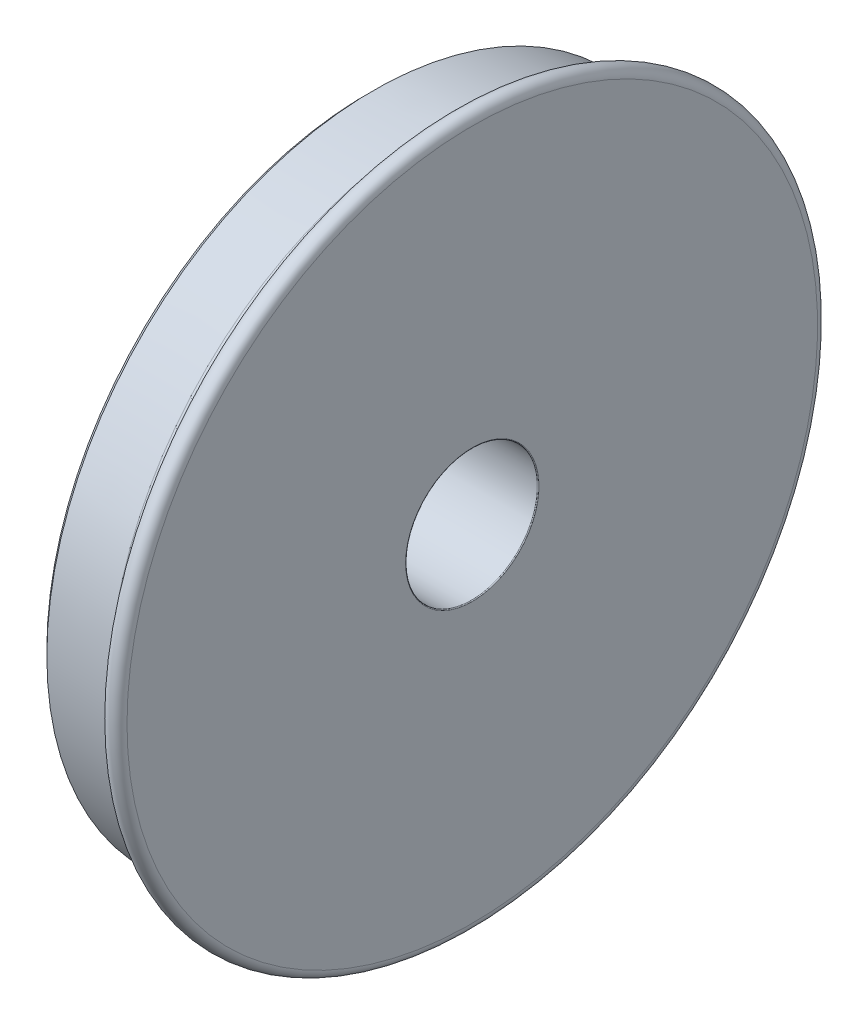
ISO-10303-21;
HEADER;
FILE_DESCRIPTION(('STEP AP214'),'2;1');
FILE_NAME('part.step','',(''),(''),'','','');
FILE_SCHEMA(('AUTOMOTIVE_DESIGN { 1 0 10303 214 1 1 1 1 }'));
ENDSEC;
DATA;
#1=APPLICATION_CONTEXT('core data for automotive mechanical design processes');
#2=APPLICATION_PROTOCOL_DEFINITION('international standard','automotive_design',2000,#1);
#3=PRODUCT_CONTEXT('',#1,'mechanical');
#4=PRODUCT('Part','Part','',(#3));
#5=PRODUCT_RELATED_PRODUCT_CATEGORY('part','',(#4));
#6=PRODUCT_DEFINITION_FORMATION('','',#4);
#7=PRODUCT_DEFINITION_CONTEXT('part definition',#1,'design');
#8=PRODUCT_DEFINITION('design','',#6,#7);
#9=PRODUCT_DEFINITION_SHAPE('','',#8);
#10=(LENGTH_UNIT() NAMED_UNIT(*) SI_UNIT(.MILLI.,.METRE.));
#11=(NAMED_UNIT(*) PLANE_ANGLE_UNIT() SI_UNIT($,.RADIAN.));
#12=(NAMED_UNIT(*) SI_UNIT($,.STERADIAN.) SOLID_ANGLE_UNIT());
#13=UNCERTAINTY_MEASURE_WITH_UNIT(LENGTH_MEASURE(1.E-05),#10,'distance_accuracy_value','');
#14=(GEOMETRIC_REPRESENTATION_CONTEXT(3) GLOBAL_UNCERTAINTY_ASSIGNED_CONTEXT((#13)) GLOBAL_UNIT_ASSIGNED_CONTEXT((#10,
#11,#12)) REPRESENTATION_CONTEXT('',''));
#15=CARTESIAN_POINT('',(0.,0.,0.));
#16=DIRECTION('',(0.,0.,1.));
#17=DIRECTION('',(1.,0.,0.));
#18=AXIS2_PLACEMENT_3D('',#15,#16,#17);
#19=CARTESIAN_POINT('',(0.,31.34,0.));
#20=DIRECTION('',(1.,0.,0.));
#21=DIRECTION('',(0.,0.,-1.));
#22=AXIS2_PLACEMENT_3D('',#19,#20,#21);
#23=PLANE('',#22);
#24=CARTESIAN_POINT('',(0.,0.,0.));
#25=DIRECTION('',(-1.,0.,0.));
#26=DIRECTION('',(0.,0.,1.));
#27=AXIS2_PLACEMENT_3D('',#24,#25,#26);
#28=CIRCLE('',#27,20.);
#29=CARTESIAN_POINT('',(0.,0.,20.));
#30=VERTEX_POINT('',#29);
#31=EDGE_CURVE('E10',#30,#30,#28,.T.);
#32=ORIENTED_EDGE('',*,*,#31,.F.);
#33=EDGE_LOOP('',(#32));
#34=FACE_BOUND('',#33,.T.);
#35=CARTESIAN_POINT('',(0.,0.,0.));
#36=DIRECTION('',(-1.,0.,0.));
#37=DIRECTION('',(0.,0.,1.));
#38=AXIS2_PLACEMENT_3D('',#35,#36,#37);
#39=CIRCLE('',#38,31.34);
#40=CARTESIAN_POINT('',(0.,0.,31.34));
#41=VERTEX_POINT('',#40);
#42=EDGE_CURVE('E80',#41,#41,#39,.T.);
#43=ORIENTED_EDGE('',*,*,#42,.T.);
#44=EDGE_LOOP('',(#43));
#45=FACE_BOUND('',#44,.T.);
#46=ADVANCED_FACE('F37',(#34,#45),#23,.F.);
#47=CARTESIAN_POINT('',(-146.164683843443,0.,0.));
#48=DIRECTION('',(-1.,0.,0.));
#49=DIRECTION('',(0.,0.,1.));
#50=AXIS2_PLACEMENT_3D('',#47,#48,#49);
#51=CYLINDRICAL_SURFACE('',#50,20.);
#52=CARTESIAN_POINT('',(34.75,0.,0.));
#53=DIRECTION('',(-1.,0.,0.));
#54=DIRECTION('',(0.,0.,1.));
#55=AXIS2_PLACEMENT_3D('',#52,#53,#54);
#56=CIRCLE('',#55,20.);
#57=CARTESIAN_POINT('',(34.75,0.,20.));
#58=VERTEX_POINT('',#57);
#59=EDGE_CURVE('E43',#58,#58,#56,.T.);
#60=ORIENTED_EDGE('',*,*,#59,.F.);
#61=EDGE_LOOP('',(#60));
#62=FACE_BOUND('',#61,.T.);
#63=ORIENTED_EDGE('',*,*,#31,.T.);
#64=EDGE_LOOP('',(#63));
#65=FACE_BOUND('',#64,.T.);
#66=ADVANCED_FACE('F147',(#62,#65),#51,.F.);
#67=CARTESIAN_POINT('',(34.75,0.,0.));
#68=DIRECTION('',(-1.,0.,0.));
#69=DIRECTION('',(0.,0.,1.));
#70=AXIS2_PLACEMENT_3D('',#67,#68,#69);
#71=TOROIDAL_SURFACE('',#70,20.25,0.25);
#72=CARTESIAN_POINT('',(35.,0.,0.));
#73=DIRECTION('',(-1.,0.,0.));
#74=DIRECTION('',(0.,0.,1.));
#75=AXIS2_PLACEMENT_3D('',#72,#73,#74);
#76=CIRCLE('',#75,20.25);
#77=CARTESIAN_POINT('',(35.,0.,20.25));
#78=VERTEX_POINT('',#77);
#79=EDGE_CURVE('E47',#78,#78,#76,.T.);
#80=ORIENTED_EDGE('',*,*,#79,.F.);
#81=EDGE_LOOP('',(#80));
#82=FACE_BOUND('',#81,.T.);
#83=ORIENTED_EDGE('',*,*,#59,.T.);
#84=EDGE_LOOP('',(#83));
#85=FACE_BOUND('',#84,.T.);
#86=ADVANCED_FACE('F142',(#82,#85),#71,.T.);
#87=CARTESIAN_POINT('',(35.,20.25,0.));
#88=DIRECTION('',(-1.,0.,0.));
#89=DIRECTION('',(0.,0.,1.));
#90=AXIS2_PLACEMENT_3D('',#87,#88,#89);
#91=PLANE('',#90);
#92=CARTESIAN_POINT('',(35.,0.,0.));
#93=DIRECTION('',(-1.,0.,0.));
#94=DIRECTION('',(0.,0.,1.));
#95=AXIS2_PLACEMENT_3D('',#92,#93,#94);
#96=CIRCLE('',#95,104.870611348438);
#97=CARTESIAN_POINT('',(35.,0.,104.870611348438));
#98=VERTEX_POINT('',#97);
#99=EDGE_CURVE('E51',#98,#98,#96,.T.);
#100=ORIENTED_EDGE('',*,*,#99,.F.);
#101=EDGE_LOOP('',(#100));
#102=FACE_BOUND('',#101,.T.);
#103=ORIENTED_EDGE('',*,*,#79,.T.);
#104=EDGE_LOOP('',(#103));
#105=FACE_BOUND('',#104,.T.);
#106=ADVANCED_FACE('F136',(#102,#105),#91,.F.);
#107=CARTESIAN_POINT('',(32.2,0.,0.));
#108=DIRECTION('',(-1.,0.,0.));
#109=DIRECTION('',(0.,0.,1.));
#110=AXIS2_PLACEMENT_3D('',#107,#108,#109);
#111=TOROIDAL_SURFACE('',#110,104.870611348438,2.8);
#112=CARTESIAN_POINT('',(29.4344726463336,0.,0.));
#113=DIRECTION('',(-1.,0.,0.));
#114=DIRECTION('',(0.,0.,1.));
#115=AXIS2_PLACEMENT_3D('',#112,#113,#114);
#116=CIRCLE('',#115,105.308627850551);
#117=CARTESIAN_POINT('',(29.4344726463336,0.,105.308627850551));
#118=VERTEX_POINT('',#117);
#119=EDGE_CURVE('E56',#118,#118,#116,.T.);
#120=ORIENTED_EDGE('',*,*,#119,.F.);
#121=EDGE_LOOP('',(#120));
#122=FACE_BOUND('',#121,.T.);
#123=ORIENTED_EDGE('',*,*,#99,.T.);
#124=EDGE_LOOP('',(#123));
#125=FACE_BOUND('',#124,.T.);
#126=ADVANCED_FACE('F130',(#122,#125),#111,.T.);
#127=CARTESIAN_POINT('',(29.4344726463336,0.,0.));
#128=DIRECTION('',(1.,0.,0.));
#129=DIRECTION('',(0.,0.,-1.));
#130=AXIS2_PLACEMENT_3D('',#127,#128,#129);
#131=CONICAL_SURFACE('',#130,105.308627850551,1.4137166941154);
#132=CARTESIAN_POINT('',(29.2384417029757,0.,0.));
#133=DIRECTION('',(-1.,0.,0.));
#134=DIRECTION('',(0.,0.,1.));
#135=AXIS2_PLACEMENT_3D('',#132,#133,#134);
#136=CIRCLE('',#135,104.070937185001);
#137=CARTESIAN_POINT('',(29.2384417029757,0.,104.070937185001));
#138=VERTEX_POINT('',#137);
#139=EDGE_CURVE('E59',#138,#138,#136,.T.);
#140=ORIENTED_EDGE('',*,*,#139,.F.);
#141=EDGE_LOOP('',(#140));
#142=FACE_BOUND('',#141,.T.);
#143=ORIENTED_EDGE('',*,*,#119,.T.);
#144=EDGE_LOOP('',(#143));
#145=FACE_BOUND('',#144,.T.);
#146=ADVANCED_FACE('F124',(#142,#145),#131,.T.);
#147=CARTESIAN_POINT('',(24.3,0.,0.));
#148=DIRECTION('',(-1.,0.,0.));
#149=DIRECTION('',(0.,0.,1.));
#150=AXIS2_PLACEMENT_3D('',#147,#148,#149);
#151=TOROIDAL_SURFACE('',#150,104.853109510203,5.);
#152=CARTESIAN_POINT('',(24.4744974835125,0.,0.));
#153=DIRECTION('',(-1.,0.,0.));
#154=DIRECTION('',(0.,0.,1.));
#155=AXIS2_PLACEMENT_3D('',#152,#153,#154);
#156=CIRCLE('',#155,99.8561553751071);
#157=CARTESIAN_POINT('',(24.4744974835125,0.,99.8561553751071));
#158=VERTEX_POINT('',#157);
#159=EDGE_CURVE('E62',#158,#158,#156,.T.);
#160=ORIENTED_EDGE('',*,*,#159,.F.);
#161=EDGE_LOOP('',(#160));
#162=FACE_BOUND('',#161,.T.);
#163=ORIENTED_EDGE('',*,*,#139,.T.);
#164=EDGE_LOOP('',(#163));
#165=FACE_BOUND('',#164,.T.);
#166=ADVANCED_FACE('F118',(#162,#165),#151,.F.);
#167=CARTESIAN_POINT('',(24.4744974835125,0.,0.));
#168=DIRECTION('',(1.,0.,0.));
#169=DIRECTION('',(0.,0.,-1.));
#170=AXIS2_PLACEMENT_3D('',#167,#168,#169);
#171=CONICAL_SURFACE('',#170,99.8561553751071,0.0349065850398791);
#172=CARTESIAN_POINT('',(4.95789496801971,0.,0.));
#173=DIRECTION('',(-1.,0.,0.));
#174=DIRECTION('',(0.,0.,1.));
#175=AXIS2_PLACEMENT_3D('',#172,#173,#174);
#176=CIRCLE('',#175,99.1746205974016);
#177=CARTESIAN_POINT('',(4.95789496801971,0.,99.1746205974016));
#178=VERTEX_POINT('',#177);
#179=EDGE_CURVE('E65',#178,#178,#176,.T.);
#180=ORIENTED_EDGE('',*,*,#179,.F.);
#181=EDGE_LOOP('',(#180));
#182=FACE_BOUND('',#181,.T.);
#183=ORIENTED_EDGE('',*,*,#159,.T.);
#184=EDGE_LOOP('',(#183));
#185=FACE_BOUND('',#184,.T.);
#186=ADVANCED_FACE('F112',(#182,#185),#171,.T.);
#187=CARTESIAN_POINT('',(4.95789496801971,0.,0.));
#188=DIRECTION('',(1.,0.,0.));
#189=DIRECTION('',(0.,0.,-1.));
#190=AXIS2_PLACEMENT_3D('',#187,#188,#189);
#191=CONICAL_SURFACE('',#190,99.1746205974016,0.785398163397457);
#192=CARTESIAN_POINT('',(3.3,0.,0.));
#193=DIRECTION('',(-1.,0.,0.));
#194=DIRECTION('',(0.,0.,1.));
#195=AXIS2_PLACEMENT_3D('',#192,#193,#194);
#196=CIRCLE('',#195,97.5167256293819);
#197=CARTESIAN_POINT('',(3.3,0.,97.5167256293819));
#198=VERTEX_POINT('',#197);
#199=EDGE_CURVE('E68',#198,#198,#196,.T.);
#200=ORIENTED_EDGE('',*,*,#199,.F.);
#201=EDGE_LOOP('',(#200));
#202=FACE_BOUND('',#201,.T.);
#203=ORIENTED_EDGE('',*,*,#179,.T.);
#204=EDGE_LOOP('',(#203));
#205=FACE_BOUND('',#204,.T.);
#206=ADVANCED_FACE('F106',(#202,#205),#191,.T.);
#207=CARTESIAN_POINT('',(3.29999999999999,79.4167256293819,0.));
#208=DIRECTION('',(1.,0.,0.));
#209=DIRECTION('',(0.,0.,-1.));
#210=AXIS2_PLACEMENT_3D('',#207,#208,#209);
#211=PLANE('',#210);
#212=CARTESIAN_POINT('',(3.3,0.,0.));
#213=DIRECTION('',(-1.,0.,0.));
#214=DIRECTION('',(0.,0.,1.));
#215=AXIS2_PLACEMENT_3D('',#212,#213,#214);
#216=CIRCLE('',#215,79.4167256293819);
#217=CARTESIAN_POINT('',(3.3,0.,79.4167256293819));
#218=VERTEX_POINT('',#217);
#219=EDGE_CURVE('E71',#218,#218,#216,.T.);
#220=ORIENTED_EDGE('',*,*,#219,.F.);
#221=EDGE_LOOP('',(#220));
#222=FACE_BOUND('',#221,.T.);
#223=ORIENTED_EDGE('',*,*,#199,.T.);
#224=EDGE_LOOP('',(#223));
#225=FACE_BOUND('',#224,.T.);
#226=ADVANCED_FACE('F100',(#222,#225),#211,.F.);
#227=CARTESIAN_POINT('',(-146.164683843443,0.,0.));
#228=DIRECTION('',(-1.,0.,0.));
#229=DIRECTION('',(0.,0.,1.));
#230=AXIS2_PLACEMENT_3D('',#227,#228,#229);
#231=CYLINDRICAL_SURFACE('',#230,79.4167256293819);
#232=CARTESIAN_POINT('',(13.3,0.,0.));
#233=DIRECTION('',(-1.,0.,0.));
#234=DIRECTION('',(0.,0.,1.));
#235=AXIS2_PLACEMENT_3D('',#232,#233,#234);
#236=CIRCLE('',#235,79.4167256293819);
#237=CARTESIAN_POINT('',(13.3,0.,79.4167256293819));
#238=VERTEX_POINT('',#237);
#239=EDGE_CURVE('E74',#238,#238,#236,.T.);
#240=ORIENTED_EDGE('',*,*,#239,.F.);
#241=EDGE_LOOP('',(#240));
#242=FACE_BOUND('',#241,.T.);
#243=ORIENTED_EDGE('',*,*,#219,.T.);
#244=EDGE_LOOP('',(#243));
#245=FACE_BOUND('',#244,.T.);
#246=ADVANCED_FACE('F94',(#242,#245),#231,.F.);
#247=CARTESIAN_POINT('',(13.3,79.4167256293819,0.));
#248=DIRECTION('',(1.,0.,0.));
#249=DIRECTION('',(0.,0.,-1.));
#250=AXIS2_PLACEMENT_3D('',#247,#248,#249);
#251=PLANE('',#250);
#252=CARTESIAN_POINT('',(13.3,0.,0.));
#253=DIRECTION('',(-1.,0.,0.));
#254=DIRECTION('',(0.,0.,1.));
#255=AXIS2_PLACEMENT_3D('',#252,#253,#254);
#256=CIRCLE('',#255,31.34);
#257=CARTESIAN_POINT('',(13.3,0.,31.34));
#258=VERTEX_POINT('',#257);
#259=EDGE_CURVE('E77',#258,#258,#256,.T.);
#260=ORIENTED_EDGE('',*,*,#259,.F.);
#261=EDGE_LOOP('',(#260));
#262=FACE_BOUND('',#261,.T.);
#263=ORIENTED_EDGE('',*,*,#239,.T.);
#264=EDGE_LOOP('',(#263));
#265=FACE_BOUND('',#264,.T.);
#266=ADVANCED_FACE('F88',(#262,#265),#251,.F.);
#267=CARTESIAN_POINT('',(-146.164683843443,0.,0.));
#268=DIRECTION('',(-1.,0.,0.));
#269=DIRECTION('',(0.,0.,1.));
#270=AXIS2_PLACEMENT_3D('',#267,#268,#269);
#271=CYLINDRICAL_SURFACE('',#270,31.34);
#272=ORIENTED_EDGE('',*,*,#42,.F.);
#273=EDGE_LOOP('',(#272));
#274=FACE_BOUND('',#273,.T.);
#275=ORIENTED_EDGE('',*,*,#259,.T.);
#276=EDGE_LOOP('',(#275));
#277=FACE_BOUND('',#276,.T.);
#278=ADVANCED_FACE('F85',(#274,#277),#271,.T.);
#279=CLOSED_SHELL('',(#46,#66,#86,#106,#126,#146,#166,#186,#206,#226,#246,#266,#278));
#280=MANIFOLD_SOLID_BREP('B2',#279);
#281=ADVANCED_BREP_SHAPE_REPRESENTATION('',(#18,#280),#14);
#282=SHAPE_DEFINITION_REPRESENTATION(#9,#281);
ENDSEC;
END-ISO-10303-21;
